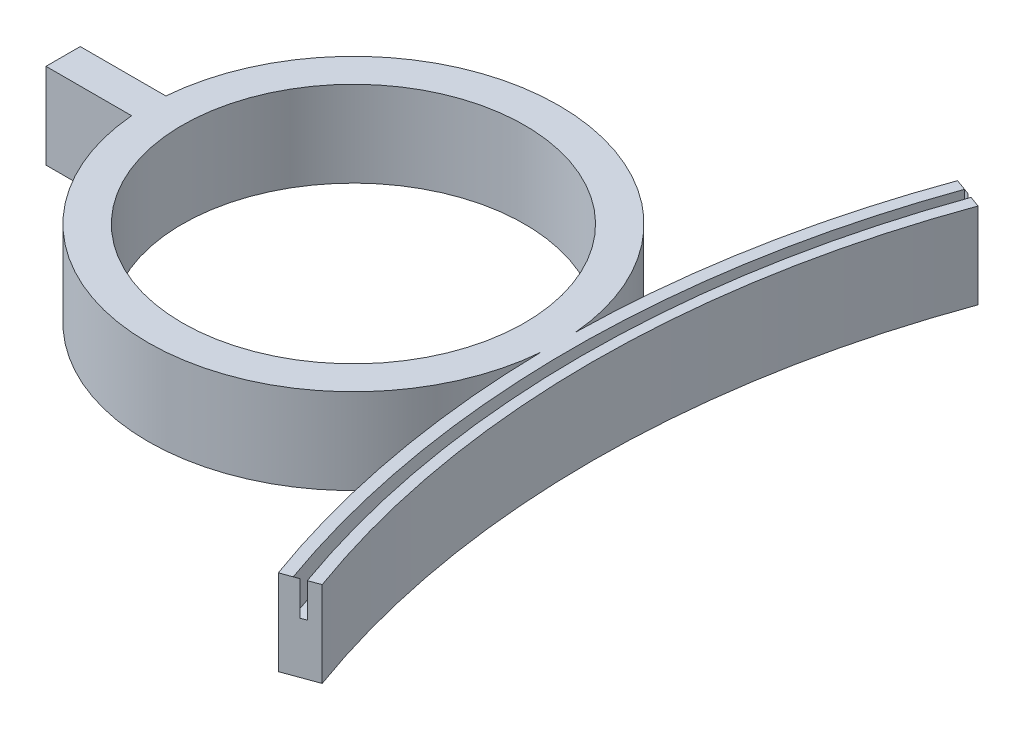
ISO-10303-21;
HEADER;
FILE_DESCRIPTION(('STEP AP214'),'2;1');
FILE_NAME('part.step','',(''),(''),'','','');
FILE_SCHEMA(('AUTOMOTIVE_DESIGN { 1 0 10303 214 1 1 1 1 }'));
ENDSEC;
DATA;
#1=APPLICATION_CONTEXT('core data for automotive mechanical design processes');
#2=APPLICATION_PROTOCOL_DEFINITION('international standard','automotive_design',2000,#1);
#3=PRODUCT_CONTEXT('',#1,'mechanical');
#4=PRODUCT('Part','Part','',(#3));
#5=PRODUCT_RELATED_PRODUCT_CATEGORY('part','',(#4));
#6=PRODUCT_DEFINITION_FORMATION('','',#4);
#7=PRODUCT_DEFINITION_CONTEXT('part definition',#1,'design');
#8=PRODUCT_DEFINITION('design','',#6,#7);
#9=PRODUCT_DEFINITION_SHAPE('','',#8);
#10=(LENGTH_UNIT() NAMED_UNIT(*) SI_UNIT(.MILLI.,.METRE.));
#11=(NAMED_UNIT(*) PLANE_ANGLE_UNIT() SI_UNIT($,.RADIAN.));
#12=(NAMED_UNIT(*) SI_UNIT($,.STERADIAN.) SOLID_ANGLE_UNIT());
#13=UNCERTAINTY_MEASURE_WITH_UNIT(LENGTH_MEASURE(1.E-05),#10,'distance_accuracy_value','');
#14=(GEOMETRIC_REPRESENTATION_CONTEXT(3) GLOBAL_UNCERTAINTY_ASSIGNED_CONTEXT((#13)) GLOBAL_UNIT_ASSIGNED_CONTEXT((#10,
#11,#12)) REPRESENTATION_CONTEXT('',''));
#15=CARTESIAN_POINT('',(0.,0.,0.));
#16=DIRECTION('',(0.,0.,1.));
#17=DIRECTION('',(1.,0.,0.));
#18=AXIS2_PLACEMENT_3D('',#15,#16,#17);
#19=CARTESIAN_POINT('',(0.,6.35,0.));
#20=DIRECTION('',(0.,1.,0.));
#21=DIRECTION('',(0.,0.,1.));
#22=AXIS2_PLACEMENT_3D('',#19,#20,#21);
#23=PLANE('',#22);
#24=CARTESIAN_POINT('',(90.1060420541205,6.35,0.));
#25=DIRECTION('',(0.,-1.,0.));
#26=DIRECTION('',(0.,0.,1.));
#27=AXIS2_PLACEMENT_3D('',#24,#25,#26);
#28=CIRCLE('',#27,73.1782916552585);
#29=CARTESIAN_POINT('',(21.1935910070689,6.35,24.6198387539356));
#30=VERTEX_POINT('',#29);
#31=CARTESIAN_POINT('',(21.1935910070689,6.35,-24.6198387539356));
#32=VERTEX_POINT('',#31);
#33=EDGE_CURVE('E230',#30,#32,#28,.T.);
#34=ORIENTED_EDGE('',*,*,#33,.F.);
#35=DIRECTION('',(0.939692620785908,0.,-0.342020143325669));
#36=VECTOR('',#35,1.);
#37=CARTESIAN_POINT('',(19.6182836070305,6.35,25.1932037573688));
#38=LINE('',#37,#36);
#39=CARTESIAN_POINT('',(22.0051028638267,6.35,24.3244725933216));
#40=VERTEX_POINT('',#39);
#41=EDGE_CURVE('E257',#30,#40,#38,.T.);
#42=ORIENTED_EDGE('',*,*,#41,.T.);
#43=CARTESIAN_POINT('',(88.8360420541205,6.35,0.));
#44=DIRECTION('',(0.,-1.,0.));
#45=DIRECTION('',(0.,0.,1.));
#46=AXIS2_PLACEMENT_3D('',#43,#44,#45);
#47=CIRCLE('',#46,71.12);
#48=CARTESIAN_POINT('',(22.0051028638268,6.35,-24.3244725933217));
#49=VERTEX_POINT('',#48);
#50=EDGE_CURVE('E261',#40,#49,#47,.T.);
#51=ORIENTED_EDGE('',*,*,#50,.T.);
#52=DIRECTION('',(-0.939692620785908,0.,-0.342020143325669));
#53=VECTOR('',#52,1.);
#54=CARTESIAN_POINT('',(19.6182836070305,6.35,-25.1932037573688));
#55=LINE('',#54,#53);
#56=EDGE_CURVE('E263',#49,#32,#55,.T.);
#57=ORIENTED_EDGE('',*,*,#56,.T.);
#58=EDGE_LOOP('',(#34,#42,#51,#57));
#59=FACE_BOUND('',#58,.T.);
#60=ADVANCED_FACE('F33',(#59),#23,.T.);
#61=DIRECTION('',(-0.941695171372508,0.,-0.33646724092206));
#62=VECTOR('',#61,1.);
#63=CARTESIAN_POINT('',(20.4289883177829,6.35,-24.895578462056));
#64=LINE('',#63,#62);
#65=CARTESIAN_POINT('',(20.8116932354286,6.35,-24.7588381753452));
#66=VERTEX_POINT('',#65);
#67=CARTESIAN_POINT('',(20.4289883177829,6.35,-24.895578462056));
#68=VERTEX_POINT('',#67);
#69=EDGE_CURVE('E219',#66,#68,#64,.T.);
#70=ORIENTED_EDGE('',*,*,#69,.F.);
#71=CARTESIAN_POINT('',(19.6182836070305,6.35,-25.1932037573688));
#72=VERTEX_POINT('',#71);
#73=EDGE_CURVE('E210',#66,#72,#55,.T.);
#74=ORIENTED_EDGE('',*,*,#73,.T.);
#75=CARTESIAN_POINT('',(88.8360420541205,6.35,0.));
#76=DIRECTION('',(0.,1.,0.));
#77=DIRECTION('',(0.,0.,1.));
#78=AXIS2_PLACEMENT_3D('',#75,#76,#77);
#79=CIRCLE('',#78,73.66);
#80=CARTESIAN_POINT('',(15.1869911437388,6.35,-1.27000000000004));
#81=VERTEX_POINT('',#80);
#82=EDGE_CURVE('E266',#72,#81,#79,.T.);
#83=ORIENTED_EDGE('',*,*,#82,.T.);
#84=CARTESIAN_POINT('',(0.,6.35,0.));
#85=DIRECTION('',(0.,1.,0.));
#86=DIRECTION('',(0.,0.,1.));
#87=AXIS2_PLACEMENT_3D('',#84,#85,#86);
#88=CIRCLE('',#87,15.24);
#89=CARTESIAN_POINT('',(-15.1869911437388,6.35,-1.27000000000001));
#90=VERTEX_POINT('',#89);
#91=EDGE_CURVE('E135',#81,#90,#88,.T.);
#92=ORIENTED_EDGE('',*,*,#91,.T.);
#93=DIRECTION('',(-1.,0.,0.));
#94=VECTOR('',#93,1.);
#95=CARTESIAN_POINT('',(-15.1869911437388,6.35,-1.27));
#96=LINE('',#95,#94);
#97=CARTESIAN_POINT('',(-21.5369911437388,6.35,-1.27));
#98=VERTEX_POINT('',#97);
#99=EDGE_CURVE('E126',#90,#98,#96,.T.);
#100=ORIENTED_EDGE('',*,*,#99,.T.);
#101=DIRECTION('',(0.,0.,1.));
#102=VECTOR('',#101,1.);
#103=CARTESIAN_POINT('',(-21.5369911437388,6.35,-1.27));
#104=LINE('',#103,#102);
#105=CARTESIAN_POINT('',(-21.5369911437388,6.35,1.27));
#106=VERTEX_POINT('',#105);
#107=EDGE_CURVE('E132',#98,#106,#104,.T.);
#108=ORIENTED_EDGE('',*,*,#107,.T.);
#109=DIRECTION('',(1.,0.,0.));
#110=VECTOR('',#109,1.);
#111=CARTESIAN_POINT('',(-15.1869911437388,6.35,1.27));
#112=LINE('',#111,#110);
#113=CARTESIAN_POINT('',(-15.1869911437388,6.35,1.27));
#114=VERTEX_POINT('',#113);
#115=EDGE_CURVE('E57',#106,#114,#112,.T.);
#116=ORIENTED_EDGE('',*,*,#115,.T.);
#117=CARTESIAN_POINT('',(0.,6.35,0.));
#118=DIRECTION('',(0.,1.,0.));
#119=DIRECTION('',(0.,0.,1.));
#120=AXIS2_PLACEMENT_3D('',#117,#118,#119);
#121=CIRCLE('',#120,15.24);
#122=CARTESIAN_POINT('',(15.1869911437388,6.35,1.27000000000001));
#123=VERTEX_POINT('',#122);
#124=EDGE_CURVE('E176',#114,#123,#121,.T.);
#125=ORIENTED_EDGE('',*,*,#124,.T.);
#126=CARTESIAN_POINT('',(88.8360420541205,6.35,0.));
#127=DIRECTION('',(0.,1.,0.));
#128=DIRECTION('',(0.,0.,1.));
#129=AXIS2_PLACEMENT_3D('',#126,#127,#128);
#130=CIRCLE('',#129,73.66);
#131=CARTESIAN_POINT('',(19.6182836070305,6.35,25.1932037573688));
#132=VERTEX_POINT('',#131);
#133=EDGE_CURVE('E105',#123,#132,#130,.T.);
#134=ORIENTED_EDGE('',*,*,#133,.T.);
#135=CARTESIAN_POINT('',(20.8116932354345,6.35,24.7588381753431));
#136=VERTEX_POINT('',#135);
#137=EDGE_CURVE('E258',#132,#136,#38,.T.);
#138=ORIENTED_EDGE('',*,*,#137,.T.);
#139=DIRECTION('',(0.941695171372508,0.,-0.33646724092206));
#140=VECTOR('',#139,1.);
#141=CARTESIAN_POINT('',(20.4289883177829,6.35,24.8955784620559));
#142=LINE('',#141,#140);
#143=CARTESIAN_POINT('',(20.4289883177829,6.35,24.8955784620559));
#144=VERTEX_POINT('',#143);
#145=EDGE_CURVE('E236',#144,#136,#142,.T.);
#146=ORIENTED_EDGE('',*,*,#145,.F.);
#147=CARTESIAN_POINT('',(90.1060420541205,6.35,0.));
#148=DIRECTION('',(0.,1.,0.));
#149=DIRECTION('',(0.,0.,1.));
#150=AXIS2_PLACEMENT_3D('',#147,#148,#149);
#151=CIRCLE('',#150,73.9910916552585);
#152=EDGE_CURVE('E228',#68,#144,#151,.T.);
#153=ORIENTED_EDGE('',*,*,#152,.F.);
#154=EDGE_LOOP('',(#70,#74,#83,#92,#100,#108,#116,#125,#134,#138,#146,#153));
#155=FACE_BOUND('',#154,.T.);
#156=CARTESIAN_POINT('',(0.,6.35,0.));
#157=DIRECTION('',(0.,1.,0.));
#158=DIRECTION('',(0.,0.,1.));
#159=AXIS2_PLACEMENT_3D('',#156,#157,#158);
#160=CIRCLE('',#159,12.7);
#161=CARTESIAN_POINT('',(0.,6.35,12.7));
#162=VERTEX_POINT('',#161);
#163=EDGE_CURVE('E160',#162,#162,#160,.T.);
#164=ORIENTED_EDGE('',*,*,#163,.F.);
#165=EDGE_LOOP('',(#164));
#166=FACE_BOUND('',#165,.T.);
#167=ADVANCED_FACE('F129',(#155,#166),#23,.T.);
#168=CARTESIAN_POINT('',(0.,0.,0.));
#169=DIRECTION('',(0.,1.,0.));
#170=DIRECTION('',(0.,0.,1.));
#171=AXIS2_PLACEMENT_3D('',#168,#169,#170);
#172=PLANE('',#171);
#173=CARTESIAN_POINT('',(0.,0.,0.));
#174=DIRECTION('',(0.,1.,0.));
#175=DIRECTION('',(0.,0.,1.));
#176=AXIS2_PLACEMENT_3D('',#173,#174,#175);
#177=CIRCLE('',#176,15.24);
#178=CARTESIAN_POINT('',(-15.1869911437388,0.,1.27));
#179=VERTEX_POINT('',#178);
#180=CARTESIAN_POINT('',(15.1869911437388,0.,1.27000000000001));
#181=VERTEX_POINT('',#180);
#182=EDGE_CURVE('E156',#179,#181,#177,.T.);
#183=ORIENTED_EDGE('',*,*,#182,.F.);
#184=DIRECTION('',(1.,0.,0.));
#185=VECTOR('',#184,1.);
#186=CARTESIAN_POINT('',(-15.1869911437388,0.,1.27));
#187=LINE('',#186,#185);
#188=CARTESIAN_POINT('',(-21.5369911437388,0.,1.27));
#189=VERTEX_POINT('',#188);
#190=EDGE_CURVE('E96',#189,#179,#187,.T.);
#191=ORIENTED_EDGE('',*,*,#190,.F.);
#192=DIRECTION('',(0.,0.,1.));
#193=VECTOR('',#192,1.);
#194=CARTESIAN_POINT('',(-21.5369911437388,0.,-1.27));
#195=LINE('',#194,#193);
#196=CARTESIAN_POINT('',(-21.5369911437388,0.,-1.27));
#197=VERTEX_POINT('',#196);
#198=EDGE_CURVE('E173',#197,#189,#195,.T.);
#199=ORIENTED_EDGE('',*,*,#198,.F.);
#200=DIRECTION('',(-1.,0.,0.));
#201=VECTOR('',#200,1.);
#202=CARTESIAN_POINT('',(-15.1869911437388,0.,-1.27));
#203=LINE('',#202,#201);
#204=CARTESIAN_POINT('',(-15.1869911437388,0.,-1.27000000000001));
#205=VERTEX_POINT('',#204);
#206=EDGE_CURVE('E144',#205,#197,#203,.T.);
#207=ORIENTED_EDGE('',*,*,#206,.F.);
#208=CARTESIAN_POINT('',(0.,0.,0.));
#209=DIRECTION('',(0.,1.,0.));
#210=DIRECTION('',(0.,0.,1.));
#211=AXIS2_PLACEMENT_3D('',#208,#209,#210);
#212=CIRCLE('',#211,15.24);
#213=CARTESIAN_POINT('',(15.1869911437388,0.,-1.27000000000004));
#214=VERTEX_POINT('',#213);
#215=EDGE_CURVE('E170',#214,#205,#212,.T.);
#216=ORIENTED_EDGE('',*,*,#215,.F.);
#217=CARTESIAN_POINT('',(88.8360420541205,0.,0.));
#218=DIRECTION('',(0.,1.,0.));
#219=DIRECTION('',(0.,0.,1.));
#220=AXIS2_PLACEMENT_3D('',#217,#218,#219);
#221=CIRCLE('',#220,73.66);
#222=CARTESIAN_POINT('',(19.6182836070305,0.,-25.1932037573688));
#223=VERTEX_POINT('',#222);
#224=EDGE_CURVE('E168',#223,#214,#221,.T.);
#225=ORIENTED_EDGE('',*,*,#224,.F.);
#226=DIRECTION('',(-0.939692620785908,0.,-0.342020143325669));
#227=VECTOR('',#226,1.);
#228=CARTESIAN_POINT('',(19.6182836070305,0.,-25.1932037573688));
#229=LINE('',#228,#227);
#230=CARTESIAN_POINT('',(22.0051028638268,0.,-24.3244725933217));
#231=VERTEX_POINT('',#230);
#232=EDGE_CURVE('E166',#231,#223,#229,.T.);
#233=ORIENTED_EDGE('',*,*,#232,.F.);
#234=CARTESIAN_POINT('',(88.8360420541205,0.,0.));
#235=DIRECTION('',(0.,-1.,0.));
#236=DIRECTION('',(0.,0.,1.));
#237=AXIS2_PLACEMENT_3D('',#234,#235,#236);
#238=CIRCLE('',#237,71.12);
#239=CARTESIAN_POINT('',(22.0051028638267,0.,24.3244725933216));
#240=VERTEX_POINT('',#239);
#241=EDGE_CURVE('E164',#240,#231,#238,.T.);
#242=ORIENTED_EDGE('',*,*,#241,.F.);
#243=DIRECTION('',(0.939692620785908,0.,-0.342020143325669));
#244=VECTOR('',#243,1.);
#245=CARTESIAN_POINT('',(19.6182836070305,0.,25.1932037573688));
#246=LINE('',#245,#244);
#247=CARTESIAN_POINT('',(19.6182836070305,0.,25.1932037573688));
#248=VERTEX_POINT('',#247);
#249=EDGE_CURVE('E162',#248,#240,#246,.T.);
#250=ORIENTED_EDGE('',*,*,#249,.F.);
#251=CARTESIAN_POINT('',(88.8360420541205,0.,0.));
#252=DIRECTION('',(0.,1.,0.));
#253=DIRECTION('',(0.,0.,1.));
#254=AXIS2_PLACEMENT_3D('',#251,#252,#253);
#255=CIRCLE('',#254,73.66);
#256=EDGE_CURVE('E159',#181,#248,#255,.T.);
#257=ORIENTED_EDGE('',*,*,#256,.F.);
#258=EDGE_LOOP('',(#183,#191,#199,#207,#216,#225,#233,#242,#250,#257));
#259=FACE_BOUND('',#258,.T.);
#260=CARTESIAN_POINT('',(0.,0.,0.));
#261=DIRECTION('',(0.,1.,0.));
#262=DIRECTION('',(0.,0.,1.));
#263=AXIS2_PLACEMENT_3D('',#260,#261,#262);
#264=CIRCLE('',#263,12.7);
#265=CARTESIAN_POINT('',(0.,0.,12.7));
#266=VERTEX_POINT('',#265);
#267=EDGE_CURVE('E250',#266,#266,#264,.T.);
#268=ORIENTED_EDGE('',*,*,#267,.T.);
#269=EDGE_LOOP('',(#268));
#270=FACE_BOUND('',#269,.T.);
#271=ADVANCED_FACE('F277',(#259,#270),#172,.F.);
#272=CARTESIAN_POINT('',(0.,6.35,0.));
#273=DIRECTION('',(0.,-1.,0.));
#274=DIRECTION('',(0.,0.,-1.));
#275=AXIS2_PLACEMENT_3D('',#272,#273,#274);
#276=CYLINDRICAL_SURFACE('',#275,15.24);
#277=ORIENTED_EDGE('',*,*,#182,.T.);
#278=DIRECTION('',(0.,-1.,0.));
#279=VECTOR('',#278,1.);
#280=CARTESIAN_POINT('',(15.1869911437388,6.35,1.27000000000001));
#281=LINE('',#280,#279);
#282=EDGE_CURVE('E195',#123,#181,#281,.T.);
#283=ORIENTED_EDGE('',*,*,#282,.F.);
#284=ORIENTED_EDGE('',*,*,#124,.F.);
#285=DIRECTION('',(0.,-1.,0.));
#286=VECTOR('',#285,1.);
#287=CARTESIAN_POINT('',(-15.1869911437388,6.35,1.27));
#288=LINE('',#287,#286);
#289=EDGE_CURVE('E152',#114,#179,#288,.T.);
#290=ORIENTED_EDGE('',*,*,#289,.T.);
#291=EDGE_LOOP('',(#277,#283,#284,#290));
#292=FACE_BOUND('',#291,.T.);
#293=ADVANCED_FACE('F35',(#292),#276,.T.);
#294=CARTESIAN_POINT('',(88.8360420541205,6.35,0.));
#295=DIRECTION('',(0.,-1.,0.));
#296=DIRECTION('',(0.,0.,-1.));
#297=AXIS2_PLACEMENT_3D('',#294,#295,#296);
#298=CYLINDRICAL_SURFACE('',#297,73.66);
#299=ORIENTED_EDGE('',*,*,#256,.T.);
#300=DIRECTION('',(0.,-1.,0.));
#301=VECTOR('',#300,1.);
#302=CARTESIAN_POINT('',(19.6182836070305,6.35,25.1932037573688));
#303=LINE('',#302,#301);
#304=EDGE_CURVE('E192',#132,#248,#303,.T.);
#305=ORIENTED_EDGE('',*,*,#304,.F.);
#306=ORIENTED_EDGE('',*,*,#133,.F.);
#307=ORIENTED_EDGE('',*,*,#282,.T.);
#308=EDGE_LOOP('',(#299,#305,#306,#307));
#309=FACE_BOUND('',#308,.T.);
#310=ADVANCED_FACE('F285',(#309),#298,.T.);
#311=CARTESIAN_POINT('',(19.6182836070305,6.35,25.1932037573688));
#312=DIRECTION('',(-0.342020143325669,0.,-0.939692620785908));
#313=DIRECTION('',(-0.939692620785908,0.,0.342020143325669));
#314=AXIS2_PLACEMENT_3D('',#311,#312,#313);
#315=PLANE('',#314);
#316=ORIENTED_EDGE('',*,*,#41,.F.);
#317=DIRECTION('',(0.,1.,0.));
#318=VECTOR('',#317,1.);
#319=CARTESIAN_POINT('',(21.1935910070689,3.81,24.6198387539356));
#320=LINE('',#319,#318);
#321=CARTESIAN_POINT('',(21.1935910070689,3.81,24.6198387539356));
#322=VERTEX_POINT('',#321);
#323=EDGE_CURVE('E247',#30,#322,#320,.F.);
#324=ORIENTED_EDGE('',*,*,#323,.T.);
#325=DIRECTION('',(0.939692620785908,0.,-0.342020143325669));
#326=VECTOR('',#325,1.);
#327=CARTESIAN_POINT('',(19.6182836070305,3.81,25.1932037573688));
#328=LINE('',#327,#326);
#329=CARTESIAN_POINT('',(20.8116932354345,3.81,24.7588381753431));
#330=VERTEX_POINT('',#329);
#331=EDGE_CURVE('E242',#330,#322,#328,.T.);
#332=ORIENTED_EDGE('',*,*,#331,.F.);
#333=DIRECTION('',(0.,1.,0.));
#334=VECTOR('',#333,1.);
#335=CARTESIAN_POINT('',(20.81169323543,6.35,24.7588381753447));
#336=LINE('',#335,#334);
#337=EDGE_CURVE('E11',#330,#136,#336,.T.);
#338=ORIENTED_EDGE('',*,*,#337,.T.);
#339=ORIENTED_EDGE('',*,*,#137,.F.);
#340=ORIENTED_EDGE('',*,*,#304,.T.);
#341=ORIENTED_EDGE('',*,*,#249,.T.);
#342=DIRECTION('',(0.,-1.,0.));
#343=VECTOR('',#342,1.);
#344=CARTESIAN_POINT('',(22.0051028638267,6.35,24.3244725933216));
#345=LINE('',#344,#343);
#346=EDGE_CURVE('E189',#40,#240,#345,.T.);
#347=ORIENTED_EDGE('',*,*,#346,.F.);
#348=EDGE_LOOP('',(#316,#324,#332,#338,#339,#340,#341,#347));
#349=FACE_BOUND('',#348,.T.);
#350=ADVANCED_FACE('F289',(#349),#315,.F.);
#351=CARTESIAN_POINT('',(88.8360420541205,6.35,0.));
#352=DIRECTION('',(0.,-1.,0.));
#353=DIRECTION('',(0.,0.,-1.));
#354=AXIS2_PLACEMENT_3D('',#351,#352,#353);
#355=CYLINDRICAL_SURFACE('',#354,71.12);
#356=ORIENTED_EDGE('',*,*,#241,.T.);
#357=DIRECTION('',(0.,-1.,0.));
#358=VECTOR('',#357,1.);
#359=CARTESIAN_POINT('',(22.0051028638268,6.35,-24.3244725933217));
#360=LINE('',#359,#358);
#361=EDGE_CURVE('E186',#49,#231,#360,.T.);
#362=ORIENTED_EDGE('',*,*,#361,.F.);
#363=ORIENTED_EDGE('',*,*,#50,.F.);
#364=ORIENTED_EDGE('',*,*,#346,.T.);
#365=EDGE_LOOP('',(#356,#362,#363,#364));
#366=FACE_BOUND('',#365,.T.);
#367=ADVANCED_FACE('F327',(#366),#355,.F.);
#368=CARTESIAN_POINT('',(19.6182836070305,6.35,-25.1932037573688));
#369=DIRECTION('',(-0.342020143325669,0.,0.939692620785908));
#370=DIRECTION('',(0.939692620785908,0.,0.342020143325669));
#371=AXIS2_PLACEMENT_3D('',#368,#369,#370);
#372=PLANE('',#371);
#373=ORIENTED_EDGE('',*,*,#73,.F.);
#374=DIRECTION('',(0.,-1.,0.));
#375=VECTOR('',#374,1.);
#376=CARTESIAN_POINT('',(20.811693235422,6.35,-24.7588381753476));
#377=LINE('',#376,#375);
#378=CARTESIAN_POINT('',(20.8116932354286,3.81,-24.7588381753452));
#379=VERTEX_POINT('',#378);
#380=EDGE_CURVE('E41',#66,#379,#377,.T.);
#381=ORIENTED_EDGE('',*,*,#380,.T.);
#382=DIRECTION('',(-0.939692620785908,0.,-0.342020143325669));
#383=VECTOR('',#382,1.);
#384=CARTESIAN_POINT('',(19.6182836070305,3.81,-25.1932037573688));
#385=LINE('',#384,#383);
#386=CARTESIAN_POINT('',(21.1935910070689,3.81,-24.6198387539356));
#387=VERTEX_POINT('',#386);
#388=EDGE_CURVE('E197',#387,#379,#385,.T.);
#389=ORIENTED_EDGE('',*,*,#388,.F.);
#390=DIRECTION('',(0.,1.,0.));
#391=VECTOR('',#390,1.);
#392=CARTESIAN_POINT('',(21.1935910070689,3.81,-24.6198387539356));
#393=LINE('',#392,#391);
#394=EDGE_CURVE('E199',#387,#32,#393,.T.);
#395=ORIENTED_EDGE('',*,*,#394,.T.);
#396=ORIENTED_EDGE('',*,*,#56,.F.);
#397=ORIENTED_EDGE('',*,*,#361,.T.);
#398=ORIENTED_EDGE('',*,*,#232,.T.);
#399=DIRECTION('',(0.,-1.,0.));
#400=VECTOR('',#399,1.);
#401=CARTESIAN_POINT('',(19.6182836070305,6.35,-25.1932037573688));
#402=LINE('',#401,#400);
#403=EDGE_CURVE('E183',#72,#223,#402,.T.);
#404=ORIENTED_EDGE('',*,*,#403,.F.);
#405=EDGE_LOOP('',(#373,#381,#389,#395,#396,#397,#398,#404));
#406=FACE_BOUND('',#405,.T.);
#407=ADVANCED_FACE('F207',(#406),#372,.F.);
#408=CARTESIAN_POINT('',(88.8360420541205,6.35,0.));
#409=DIRECTION('',(0.,-1.,0.));
#410=DIRECTION('',(0.,0.,-1.));
#411=AXIS2_PLACEMENT_3D('',#408,#409,#410);
#412=CYLINDRICAL_SURFACE('',#411,73.66);
#413=ORIENTED_EDGE('',*,*,#224,.T.);
#414=DIRECTION('',(0.,-1.,0.));
#415=VECTOR('',#414,1.);
#416=CARTESIAN_POINT('',(15.1869911437388,6.35,-1.27000000000004));
#417=LINE('',#416,#415);
#418=EDGE_CURVE('E180',#81,#214,#417,.T.);
#419=ORIENTED_EDGE('',*,*,#418,.F.);
#420=ORIENTED_EDGE('',*,*,#82,.F.);
#421=ORIENTED_EDGE('',*,*,#403,.T.);
#422=EDGE_LOOP('',(#413,#419,#420,#421));
#423=FACE_BOUND('',#422,.T.);
#424=ADVANCED_FACE('F270',(#423),#412,.T.);
#425=CARTESIAN_POINT('',(0.,6.35,0.));
#426=DIRECTION('',(0.,-1.,0.));
#427=DIRECTION('',(0.,0.,-1.));
#428=AXIS2_PLACEMENT_3D('',#425,#426,#427);
#429=CYLINDRICAL_SURFACE('',#428,15.24);
#430=ORIENTED_EDGE('',*,*,#215,.T.);
#431=DIRECTION('',(0.,-1.,0.));
#432=VECTOR('',#431,1.);
#433=CARTESIAN_POINT('',(-15.1869911437388,6.35,-1.27000000000001));
#434=LINE('',#433,#432);
#435=EDGE_CURVE('E147',#90,#205,#434,.T.);
#436=ORIENTED_EDGE('',*,*,#435,.F.);
#437=ORIENTED_EDGE('',*,*,#91,.F.);
#438=ORIENTED_EDGE('',*,*,#418,.T.);
#439=EDGE_LOOP('',(#430,#436,#437,#438));
#440=FACE_BOUND('',#439,.T.);
#441=ADVANCED_FACE('F274',(#440),#429,.T.);
#442=CARTESIAN_POINT('',(-15.1869911437388,6.35,-1.27));
#443=DIRECTION('',(0.,0.,1.));
#444=DIRECTION('',(1.,0.,0.));
#445=AXIS2_PLACEMENT_3D('',#442,#443,#444);
#446=PLANE('',#445);
#447=ORIENTED_EDGE('',*,*,#206,.T.);
#448=DIRECTION('',(0.,-1.,0.));
#449=VECTOR('',#448,1.);
#450=CARTESIAN_POINT('',(-21.5369911437388,6.35,-1.27));
#451=LINE('',#450,#449);
#452=EDGE_CURVE('E141',#98,#197,#451,.T.);
#453=ORIENTED_EDGE('',*,*,#452,.F.);
#454=ORIENTED_EDGE('',*,*,#99,.F.);
#455=ORIENTED_EDGE('',*,*,#435,.T.);
#456=EDGE_LOOP('',(#447,#453,#454,#455));
#457=FACE_BOUND('',#456,.T.);
#458=ADVANCED_FACE('F142',(#457),#446,.F.);
#459=CARTESIAN_POINT('',(-21.5369911437388,6.35,-1.27));
#460=DIRECTION('',(1.,0.,0.));
#461=DIRECTION('',(0.,0.,-1.));
#462=AXIS2_PLACEMENT_3D('',#459,#460,#461);
#463=PLANE('',#462);
#464=ORIENTED_EDGE('',*,*,#198,.T.);
#465=DIRECTION('',(0.,-1.,0.));
#466=VECTOR('',#465,1.);
#467=CARTESIAN_POINT('',(-21.5369911437388,6.35,1.27));
#468=LINE('',#467,#466);
#469=EDGE_CURVE('E148',#106,#189,#468,.T.);
#470=ORIENTED_EDGE('',*,*,#469,.F.);
#471=ORIENTED_EDGE('',*,*,#107,.F.);
#472=ORIENTED_EDGE('',*,*,#452,.T.);
#473=EDGE_LOOP('',(#464,#470,#471,#472));
#474=FACE_BOUND('',#473,.T.);
#475=ADVANCED_FACE('F150',(#474),#463,.F.);
#476=CARTESIAN_POINT('',(-15.1869911437388,6.35,1.27));
#477=DIRECTION('',(0.,0.,-1.));
#478=DIRECTION('',(-1.,0.,0.));
#479=AXIS2_PLACEMENT_3D('',#476,#477,#478);
#480=PLANE('',#479);
#481=ORIENTED_EDGE('',*,*,#190,.T.);
#482=ORIENTED_EDGE('',*,*,#289,.F.);
#483=ORIENTED_EDGE('',*,*,#115,.F.);
#484=ORIENTED_EDGE('',*,*,#469,.T.);
#485=EDGE_LOOP('',(#481,#482,#483,#484));
#486=FACE_BOUND('',#485,.T.);
#487=ADVANCED_FACE('F279',(#486),#480,.F.);
#488=CARTESIAN_POINT('',(0.,6.35,0.));
#489=DIRECTION('',(0.,-1.,0.));
#490=DIRECTION('',(0.,0.,-1.));
#491=AXIS2_PLACEMENT_3D('',#488,#489,#490);
#492=CYLINDRICAL_SURFACE('',#491,12.7);
#493=ORIENTED_EDGE('',*,*,#163,.T.);
#494=EDGE_LOOP('',(#493));
#495=FACE_BOUND('',#494,.T.);
#496=ORIENTED_EDGE('',*,*,#267,.F.);
#497=EDGE_LOOP('',(#496));
#498=FACE_BOUND('',#497,.T.);
#499=ADVANCED_FACE('F345',(#495,#498),#492,.F.);
#500=CARTESIAN_POINT('',(20.4289883177829,3.81,24.8955784620559));
#501=DIRECTION('',(0.33646724092206,0.,0.941695171372508));
#502=DIRECTION('',(0.941695171372508,0.,-0.33646724092206));
#503=AXIS2_PLACEMENT_3D('',#500,#501,#502);
#504=PLANE('',#503);
#505=DIRECTION('',(0.941695171372508,0.,-0.33646724092206));
#506=VECTOR('',#505,1.);
#507=CARTESIAN_POINT('',(20.4289883177829,3.81,24.8955784620559));
#508=LINE('',#507,#506);
#509=CARTESIAN_POINT('',(20.4289883177829,3.81,24.8955784620559));
#510=VERTEX_POINT('',#509);
#511=EDGE_CURVE('E233',#510,#330,#508,.T.);
#512=ORIENTED_EDGE('',*,*,#511,.F.);
#513=DIRECTION('',(0.,1.,0.));
#514=VECTOR('',#513,1.);
#515=CARTESIAN_POINT('',(20.4289883177829,3.81,24.8955784620559));
#516=LINE('',#515,#514);
#517=EDGE_CURVE('E243',#510,#144,#516,.T.);
#518=ORIENTED_EDGE('',*,*,#517,.T.);
#519=ORIENTED_EDGE('',*,*,#145,.T.);
#520=ORIENTED_EDGE('',*,*,#337,.F.);
#521=EDGE_LOOP('',(#512,#518,#519,#520));
#522=FACE_BOUND('',#521,.T.);
#523=ADVANCED_FACE('F299',(#522),#504,.F.);
#524=CARTESIAN_POINT('',(20.4289883177829,3.81,-24.895578462056));
#525=DIRECTION('',(0.33646724092206,0.,-0.941695171372508));
#526=DIRECTION('',(-0.941695171372508,0.,-0.33646724092206));
#527=AXIS2_PLACEMENT_3D('',#524,#525,#526);
#528=PLANE('',#527);
#529=ORIENTED_EDGE('',*,*,#69,.T.);
#530=DIRECTION('',(0.,1.,0.));
#531=VECTOR('',#530,1.);
#532=CARTESIAN_POINT('',(20.4289883177829,3.81,-24.895578462056));
#533=LINE('',#532,#531);
#534=CARTESIAN_POINT('',(20.4289883177829,3.81,-24.895578462056));
#535=VERTEX_POINT('',#534);
#536=EDGE_CURVE('E240',#535,#68,#533,.T.);
#537=ORIENTED_EDGE('',*,*,#536,.F.);
#538=DIRECTION('',(-0.941695171372508,0.,-0.33646724092206));
#539=VECTOR('',#538,1.);
#540=CARTESIAN_POINT('',(20.4289883177829,3.81,-24.895578462056));
#541=LINE('',#540,#539);
#542=EDGE_CURVE('E222',#379,#535,#541,.T.);
#543=ORIENTED_EDGE('',*,*,#542,.F.);
#544=ORIENTED_EDGE('',*,*,#380,.F.);
#545=EDGE_LOOP('',(#529,#537,#543,#544));
#546=FACE_BOUND('',#545,.T.);
#547=ADVANCED_FACE('F216',(#546),#528,.F.);
#548=CARTESIAN_POINT('',(90.1060420541205,3.81,0.));
#549=DIRECTION('',(0.,1.,0.));
#550=DIRECTION('',(0.,0.,1.));
#551=AXIS2_PLACEMENT_3D('',#548,#549,#550);
#552=CYLINDRICAL_SURFACE('',#551,73.1782916552585);
#553=ORIENTED_EDGE('',*,*,#33,.T.);
#554=ORIENTED_EDGE('',*,*,#394,.F.);
#555=CARTESIAN_POINT('',(90.1060420541205,3.81,0.));
#556=DIRECTION('',(0.,-1.,0.));
#557=DIRECTION('',(0.,0.,1.));
#558=AXIS2_PLACEMENT_3D('',#555,#556,#557);
#559=CIRCLE('',#558,73.1782916552585);
#560=EDGE_CURVE('E48',#322,#387,#559,.T.);
#561=ORIENTED_EDGE('',*,*,#560,.F.);
#562=ORIENTED_EDGE('',*,*,#323,.F.);
#563=EDGE_LOOP('',(#553,#554,#561,#562));
#564=FACE_BOUND('',#563,.T.);
#565=ADVANCED_FACE('F320',(#564),#552,.T.);
#566=CARTESIAN_POINT('',(90.1060420541205,3.81,0.));
#567=DIRECTION('',(0.,1.,0.));
#568=DIRECTION('',(0.,0.,1.));
#569=AXIS2_PLACEMENT_3D('',#566,#567,#568);
#570=PLANE('',#569);
#571=ORIENTED_EDGE('',*,*,#331,.T.);
#572=ORIENTED_EDGE('',*,*,#560,.T.);
#573=ORIENTED_EDGE('',*,*,#388,.T.);
#574=ORIENTED_EDGE('',*,*,#542,.T.);
#575=CARTESIAN_POINT('',(90.1060420541205,3.81,0.));
#576=DIRECTION('',(0.,1.,0.));
#577=DIRECTION('',(0.,0.,1.));
#578=AXIS2_PLACEMENT_3D('',#575,#576,#577);
#579=CIRCLE('',#578,73.9910916552585);
#580=EDGE_CURVE('E229',#535,#510,#579,.T.);
#581=ORIENTED_EDGE('',*,*,#580,.T.);
#582=ORIENTED_EDGE('',*,*,#511,.T.);
#583=EDGE_LOOP('',(#571,#572,#573,#574,#581,#582));
#584=FACE_BOUND('',#583,.T.);
#585=ADVANCED_FACE('F301',(#584),#570,.T.);
#586=CARTESIAN_POINT('',(90.1060420541205,3.81,0.));
#587=DIRECTION('',(0.,1.,0.));
#588=DIRECTION('',(0.,0.,1.));
#589=AXIS2_PLACEMENT_3D('',#586,#587,#588);
#590=CYLINDRICAL_SURFACE('',#589,73.9910916552585);
#591=ORIENTED_EDGE('',*,*,#152,.T.);
#592=ORIENTED_EDGE('',*,*,#517,.F.);
#593=ORIENTED_EDGE('',*,*,#580,.F.);
#594=ORIENTED_EDGE('',*,*,#536,.T.);
#595=EDGE_LOOP('',(#591,#592,#593,#594));
#596=FACE_BOUND('',#595,.T.);
#597=ADVANCED_FACE('F310',(#596),#590,.F.);
#598=CLOSED_SHELL('',(#60,#167,#271,#293,#310,#350,#367,#407,#424,#441,#458,#475,#487,#499,#523,
#547,#565,#585,#597));
#599=MANIFOLD_SOLID_BREP('B2',#598);
#600=ADVANCED_BREP_SHAPE_REPRESENTATION('',(#18,#599),#14);
#601=SHAPE_DEFINITION_REPRESENTATION(#9,#600);
ENDSEC;
END-ISO-10303-21;
